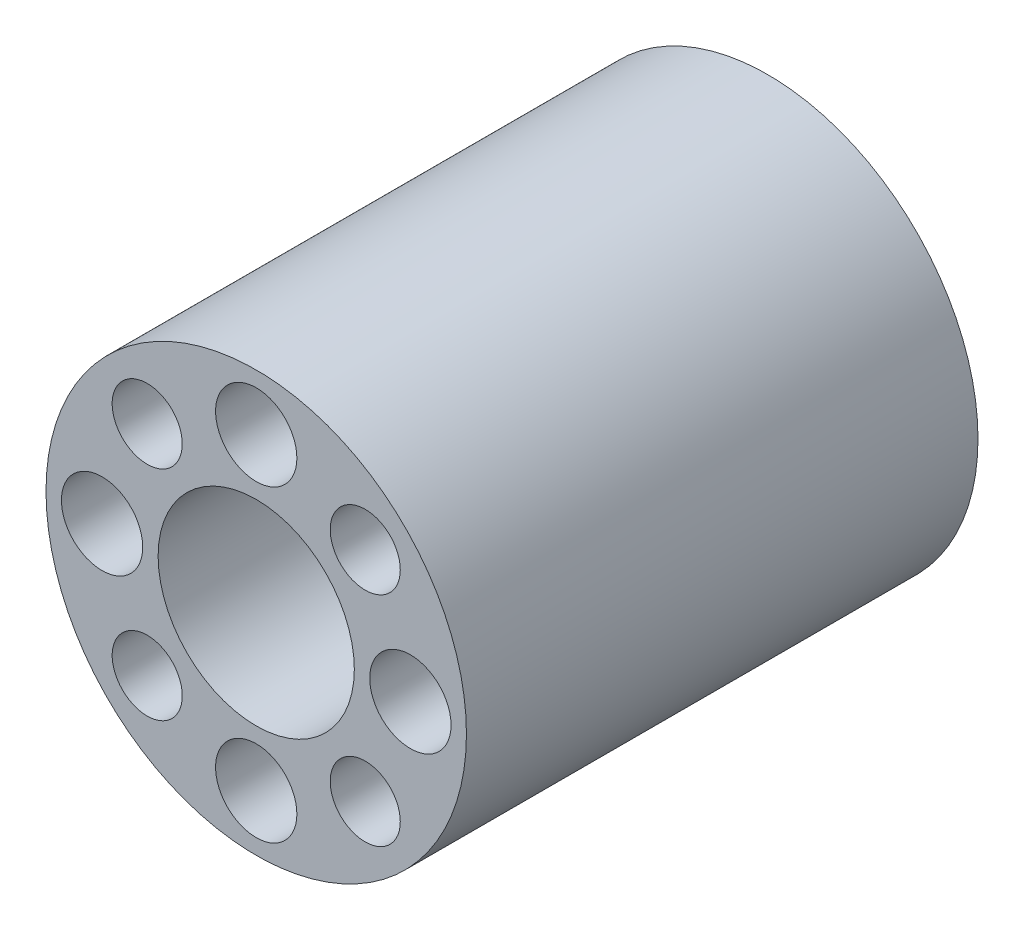
ISO-10303-21;
HEADER;
FILE_DESCRIPTION(('STEP AP214'),'2;1');
FILE_NAME('part.step','',(''),(''),'','','');
FILE_SCHEMA(('AUTOMOTIVE_DESIGN { 1 0 10303 214 1 1 1 1 }'));
ENDSEC;
DATA;
#1=APPLICATION_CONTEXT('core data for automotive mechanical design processes');
#2=APPLICATION_PROTOCOL_DEFINITION('international standard','automotive_design',2000,#1);
#3=PRODUCT_CONTEXT('',#1,'mechanical');
#4=PRODUCT('Part','Part','',(#3));
#5=PRODUCT_RELATED_PRODUCT_CATEGORY('part','',(#4));
#6=PRODUCT_DEFINITION_FORMATION('','',#4);
#7=PRODUCT_DEFINITION_CONTEXT('part definition',#1,'design');
#8=PRODUCT_DEFINITION('design','',#6,#7);
#9=PRODUCT_DEFINITION_SHAPE('','',#8);
#10=(LENGTH_UNIT() NAMED_UNIT(*) SI_UNIT(.MILLI.,.METRE.));
#11=(NAMED_UNIT(*) PLANE_ANGLE_UNIT() SI_UNIT($,.RADIAN.));
#12=(NAMED_UNIT(*) SI_UNIT($,.STERADIAN.) SOLID_ANGLE_UNIT());
#13=UNCERTAINTY_MEASURE_WITH_UNIT(LENGTH_MEASURE(1.E-05),#10,'distance_accuracy_value','');
#14=(GEOMETRIC_REPRESENTATION_CONTEXT(3) GLOBAL_UNCERTAINTY_ASSIGNED_CONTEXT((#13)) GLOBAL_UNIT_ASSIGNED_CONTEXT((#10,
#11,#12)) REPRESENTATION_CONTEXT('',''));
#15=CARTESIAN_POINT('',(0.,0.,0.));
#16=DIRECTION('',(0.,0.,1.));
#17=DIRECTION('',(1.,0.,0.));
#18=AXIS2_PLACEMENT_3D('',#15,#16,#17);
#19=CARTESIAN_POINT('',(-11.,0.,36.5));
#20=DIRECTION('',(0.,0.,-1.));
#21=DIRECTION('',(-1.,0.,0.));
#22=AXIS2_PLACEMENT_3D('',#19,#20,#21);
#23=CYLINDRICAL_SURFACE('',#22,1.65);
#24=CARTESIAN_POINT('',(-11.,0.,0.));
#25=DIRECTION('',(0.,0.,1.));
#26=DIRECTION('',(1.,0.,0.));
#27=AXIS2_PLACEMENT_3D('',#24,#25,#26);
#28=CIRCLE('',#27,1.65);
#29=CARTESIAN_POINT('',(-9.35,0.,0.));
#30=VERTEX_POINT('',#29);
#31=EDGE_CURVE('E86',#30,#30,#28,.T.);
#32=ORIENTED_EDGE('',*,*,#31,.F.);
#33=EDGE_LOOP('',(#32));
#34=FACE_BOUND('',#33,.T.);
#35=CARTESIAN_POINT('',(-11.,0.,12.));
#36=DIRECTION('',(0.,0.,1.));
#37=DIRECTION('',(1.,0.,0.));
#38=AXIS2_PLACEMENT_3D('',#35,#36,#37);
#39=CIRCLE('',#38,1.65);
#40=CARTESIAN_POINT('',(-9.35,0.,12.));
#41=VERTEX_POINT('',#40);
#42=EDGE_CURVE('E43',#41,#41,#39,.T.);
#43=ORIENTED_EDGE('',*,*,#42,.T.);
#44=EDGE_LOOP('',(#43));
#45=FACE_BOUND('',#44,.T.);
#46=ADVANCED_FACE('F39',(#34,#45),#23,.F.);
#47=CARTESIAN_POINT('',(1.95156391047391E-13,11.,36.5));
#48=DIRECTION('',(0.,0.,-1.));
#49=DIRECTION('',(-1.,0.,0.));
#50=AXIS2_PLACEMENT_3D('',#47,#48,#49);
#51=CYLINDRICAL_SURFACE('',#50,1.65);
#52=CARTESIAN_POINT('',(1.95156391047391E-13,11.,0.));
#53=DIRECTION('',(0.,0.,1.));
#54=DIRECTION('',(1.,0.,0.));
#55=AXIS2_PLACEMENT_3D('',#52,#53,#54);
#56=CIRCLE('',#55,1.65);
#57=CARTESIAN_POINT('',(1.6500000000002,11.,0.));
#58=VERTEX_POINT('',#57);
#59=EDGE_CURVE('E78',#58,#58,#56,.T.);
#60=ORIENTED_EDGE('',*,*,#59,.F.);
#61=EDGE_LOOP('',(#60));
#62=FACE_BOUND('',#61,.T.);
#63=CARTESIAN_POINT('',(1.95156391047391E-13,11.,12.));
#64=DIRECTION('',(0.,0.,1.));
#65=DIRECTION('',(1.,0.,0.));
#66=AXIS2_PLACEMENT_3D('',#63,#64,#65);
#67=CIRCLE('',#66,1.65);
#68=CARTESIAN_POINT('',(1.6500000000002,11.,12.));
#69=VERTEX_POINT('',#68);
#70=EDGE_CURVE('E64',#69,#69,#67,.T.);
#71=ORIENTED_EDGE('',*,*,#70,.T.);
#72=EDGE_LOOP('',(#71));
#73=FACE_BOUND('',#72,.T.);
#74=ADVANCED_FACE('F112',(#62,#73),#51,.F.);
#75=CARTESIAN_POINT('',(11.,-2.34187669256869E-13,36.5));
#76=DIRECTION('',(0.,0.,-1.));
#77=DIRECTION('',(-1.,0.,0.));
#78=AXIS2_PLACEMENT_3D('',#75,#76,#77);
#79=CYLINDRICAL_SURFACE('',#78,1.65);
#80=CARTESIAN_POINT('',(11.,-2.34187669256869E-13,0.));
#81=DIRECTION('',(0.,0.,1.));
#82=DIRECTION('',(1.,0.,0.));
#83=AXIS2_PLACEMENT_3D('',#80,#81,#82);
#84=CIRCLE('',#83,1.65);
#85=CARTESIAN_POINT('',(12.65,-2.34187669256869E-13,0.));
#86=VERTEX_POINT('',#85);
#87=EDGE_CURVE('E73',#86,#86,#84,.T.);
#88=ORIENTED_EDGE('',*,*,#87,.F.);
#89=EDGE_LOOP('',(#88));
#90=FACE_BOUND('',#89,.T.);
#91=CARTESIAN_POINT('',(11.,-2.34187669256869E-13,12.));
#92=DIRECTION('',(0.,0.,1.));
#93=DIRECTION('',(1.,0.,0.));
#94=AXIS2_PLACEMENT_3D('',#91,#92,#93);
#95=CIRCLE('',#94,1.65);
#96=CARTESIAN_POINT('',(12.65,-2.34187669256869E-13,12.));
#97=VERTEX_POINT('',#96);
#98=EDGE_CURVE('E61',#97,#97,#95,.T.);
#99=ORIENTED_EDGE('',*,*,#98,.T.);
#100=EDGE_LOOP('',(#99));
#101=FACE_BOUND('',#100,.T.);
#102=ADVANCED_FACE('F117',(#90,#101),#79,.F.);
#103=CARTESIAN_POINT('',(-2.68456451094007E-13,-11.,36.5));
#104=DIRECTION('',(0.,0.,-1.));
#105=DIRECTION('',(-1.,0.,0.));
#106=AXIS2_PLACEMENT_3D('',#103,#104,#105);
#107=CYLINDRICAL_SURFACE('',#106,1.65);
#108=CARTESIAN_POINT('',(-2.68456451094007E-13,-11.,0.));
#109=DIRECTION('',(0.,0.,1.));
#110=DIRECTION('',(1.,0.,0.));
#111=AXIS2_PLACEMENT_3D('',#108,#109,#110);
#112=CIRCLE('',#111,1.65);
#113=CARTESIAN_POINT('',(1.64999999999973,-11.,0.));
#114=VERTEX_POINT('',#113);
#115=EDGE_CURVE('E69',#114,#114,#112,.T.);
#116=ORIENTED_EDGE('',*,*,#115,.F.);
#117=EDGE_LOOP('',(#116));
#118=FACE_BOUND('',#117,.T.);
#119=CARTESIAN_POINT('',(-2.68456451094007E-13,-11.,12.));
#120=DIRECTION('',(0.,0.,1.));
#121=DIRECTION('',(1.,0.,0.));
#122=AXIS2_PLACEMENT_3D('',#119,#120,#121);
#123=CIRCLE('',#122,1.65);
#124=CARTESIAN_POINT('',(1.64999999999973,-11.,12.));
#125=VERTEX_POINT('',#124);
#126=EDGE_CURVE('E58',#125,#125,#123,.T.);
#127=ORIENTED_EDGE('',*,*,#126,.T.);
#128=EDGE_LOOP('',(#127));
#129=FACE_BOUND('',#128,.T.);
#130=ADVANCED_FACE('F124',(#118,#129),#107,.F.);
#131=CARTESIAN_POINT('',(0.,0.,36.5));
#132=DIRECTION('',(0.,0.,1.));
#133=DIRECTION('',(1.,0.,0.));
#134=AXIS2_PLACEMENT_3D('',#131,#132,#133);
#135=PLANE('',#134);
#136=CARTESIAN_POINT('',(-7.77817459305206,-7.77817459305198,36.5));
#137=DIRECTION('',(0.,0.,1.));
#138=DIRECTION('',(1.,0.,0.));
#139=AXIS2_PLACEMENT_3D('',#136,#137,#138);
#140=CIRCLE('',#139,2.5);
#141=CARTESIAN_POINT('',(-5.27817459305206,-7.77817459305198,36.5));
#142=VERTEX_POINT('',#141);
#143=EDGE_CURVE('E211',#142,#142,#140,.T.);
#144=ORIENTED_EDGE('',*,*,#143,.F.);
#145=EDGE_LOOP('',(#144));
#146=FACE_BOUND('',#145,.T.);
#147=CARTESIAN_POINT('',(7.77817459305201,-7.77817459305204,36.5));
#148=DIRECTION('',(0.,0.,1.));
#149=DIRECTION('',(1.,0.,0.));
#150=AXIS2_PLACEMENT_3D('',#147,#148,#149);
#151=CIRCLE('',#150,2.5);
#152=CARTESIAN_POINT('',(10.278174593052,-7.77817459305204,36.5));
#153=VERTEX_POINT('',#152);
#154=EDGE_CURVE('E203',#153,#153,#151,.T.);
#155=ORIENTED_EDGE('',*,*,#154,.F.);
#156=EDGE_LOOP('',(#155));
#157=FACE_BOUND('',#156,.T.);
#158=CARTESIAN_POINT('',(7.77817459305201,7.77817459305204,36.5));
#159=DIRECTION('',(0.,0.,1.));
#160=DIRECTION('',(1.,0.,0.));
#161=AXIS2_PLACEMENT_3D('',#158,#159,#160);
#162=CIRCLE('',#161,2.5);
#163=CARTESIAN_POINT('',(10.278174593052,7.77817459305204,36.5));
#164=VERTEX_POINT('',#163);
#165=EDGE_CURVE('E196',#164,#164,#162,.T.);
#166=ORIENTED_EDGE('',*,*,#165,.F.);
#167=EDGE_LOOP('',(#166));
#168=FACE_BOUND('',#167,.T.);
#169=CARTESIAN_POINT('',(-7.77817459305206,7.77817459305198,36.5));
#170=DIRECTION('',(0.,0.,1.));
#171=DIRECTION('',(1.,0.,0.));
#172=AXIS2_PLACEMENT_3D('',#169,#170,#171);
#173=CIRCLE('',#172,2.5);
#174=CARTESIAN_POINT('',(-5.27817459305206,7.77817459305198,36.5));
#175=VERTEX_POINT('',#174);
#176=EDGE_CURVE('E198',#175,#175,#173,.T.);
#177=ORIENTED_EDGE('',*,*,#176,.F.);
#178=EDGE_LOOP('',(#177));
#179=FACE_BOUND('',#178,.T.);
#180=CARTESIAN_POINT('',(0.,11.,36.5));
#181=DIRECTION('',(0.,0.,1.));
#182=DIRECTION('',(1.,0.,0.));
#183=AXIS2_PLACEMENT_3D('',#180,#181,#182);
#184=CIRCLE('',#183,2.9);
#185=CARTESIAN_POINT('',(2.90000000000004,11.,36.5));
#186=VERTEX_POINT('',#185);
#187=EDGE_CURVE('E220',#186,#186,#184,.T.);
#188=ORIENTED_EDGE('',*,*,#187,.F.);
#189=EDGE_LOOP('',(#188));
#190=FACE_BOUND('',#189,.T.);
#191=CARTESIAN_POINT('',(11.,0.,36.5));
#192=DIRECTION('',(0.,0.,1.));
#193=DIRECTION('',(1.,0.,0.));
#194=AXIS2_PLACEMENT_3D('',#191,#192,#193);
#195=CIRCLE('',#194,2.9);
#196=CARTESIAN_POINT('',(13.9,0.,36.5));
#197=VERTEX_POINT('',#196);
#198=EDGE_CURVE('E223',#197,#197,#195,.T.);
#199=ORIENTED_EDGE('',*,*,#198,.F.);
#200=EDGE_LOOP('',(#199));
#201=FACE_BOUND('',#200,.T.);
#202=CARTESIAN_POINT('',(-11.,0.,36.5));
#203=DIRECTION('',(0.,0.,1.));
#204=DIRECTION('',(1.,0.,0.));
#205=AXIS2_PLACEMENT_3D('',#202,#203,#204);
#206=CIRCLE('',#205,2.9);
#207=CARTESIAN_POINT('',(-8.1,0.,36.5));
#208=VERTEX_POINT('',#207);
#209=EDGE_CURVE('E229',#208,#208,#206,.T.);
#210=ORIENTED_EDGE('',*,*,#209,.F.);
#211=EDGE_LOOP('',(#210));
#212=FACE_BOUND('',#211,.T.);
#213=CARTESIAN_POINT('',(-1.15218884181823E-13,-11.,36.5));
#214=DIRECTION('',(0.,0.,1.));
#215=DIRECTION('',(1.,0.,0.));
#216=AXIS2_PLACEMENT_3D('',#213,#214,#215);
#217=CIRCLE('',#216,2.9);
#218=CARTESIAN_POINT('',(2.89999999999988,-11.,36.5));
#219=VERTEX_POINT('',#218);
#220=EDGE_CURVE('E81',#219,#219,#217,.T.);
#221=ORIENTED_EDGE('',*,*,#220,.F.);
#222=EDGE_LOOP('',(#221));
#223=FACE_BOUND('',#222,.T.);
#224=CARTESIAN_POINT('',(0.,0.,36.5));
#225=DIRECTION('',(0.,0.,1.));
#226=DIRECTION('',(1.,0.,0.));
#227=AXIS2_PLACEMENT_3D('',#224,#225,#226);
#228=CIRCLE('',#227,15.);
#229=CARTESIAN_POINT('',(15.,0.,36.5));
#230=VERTEX_POINT('',#229);
#231=EDGE_CURVE('E11',#230,#230,#228,.T.);
#232=ORIENTED_EDGE('',*,*,#231,.T.);
#233=EDGE_LOOP('',(#232));
#234=FACE_BOUND('',#233,.T.);
#235=CARTESIAN_POINT('',(0.,0.,36.5));
#236=DIRECTION('',(0.,0.,1.));
#237=DIRECTION('',(1.,0.,0.));
#238=AXIS2_PLACEMENT_3D('',#235,#236,#237);
#239=CIRCLE('',#238,7.);
#240=CARTESIAN_POINT('',(7.,0.,36.5));
#241=VERTEX_POINT('',#240);
#242=EDGE_CURVE('E52',#241,#241,#239,.T.);
#243=ORIENTED_EDGE('',*,*,#242,.F.);
#244=EDGE_LOOP('',(#243));
#245=FACE_BOUND('',#244,.T.);
#246=ADVANCED_FACE('F128',(#146,#157,#168,#179,#190,#201,#212,#223,#234,#245),#135,.T.);
#247=CARTESIAN_POINT('',(0.,0.,0.));
#248=DIRECTION('',(0.,0.,1.));
#249=DIRECTION('',(1.,0.,0.));
#250=AXIS2_PLACEMENT_3D('',#247,#248,#249);
#251=PLANE('',#250);
#252=CARTESIAN_POINT('',(0.,0.,0.));
#253=DIRECTION('',(0.,0.,1.));
#254=DIRECTION('',(1.,0.,0.));
#255=AXIS2_PLACEMENT_3D('',#252,#253,#254);
#256=CIRCLE('',#255,15.);
#257=CARTESIAN_POINT('',(15.,0.,0.));
#258=VERTEX_POINT('',#257);
#259=EDGE_CURVE('E47',#258,#258,#256,.T.);
#260=ORIENTED_EDGE('',*,*,#259,.F.);
#261=EDGE_LOOP('',(#260));
#262=FACE_BOUND('',#261,.T.);
#263=CARTESIAN_POINT('',(0.,0.,0.));
#264=DIRECTION('',(0.,0.,1.));
#265=DIRECTION('',(1.,0.,0.));
#266=AXIS2_PLACEMENT_3D('',#263,#264,#265);
#267=CIRCLE('',#266,7.);
#268=CARTESIAN_POINT('',(7.,0.,0.));
#269=VERTEX_POINT('',#268);
#270=EDGE_CURVE('E55',#269,#269,#267,.T.);
#271=ORIENTED_EDGE('',*,*,#270,.T.);
#272=EDGE_LOOP('',(#271));
#273=FACE_BOUND('',#272,.T.);
#274=ORIENTED_EDGE('',*,*,#31,.T.);
#275=EDGE_LOOP('',(#274));
#276=FACE_BOUND('',#275,.T.);
#277=ORIENTED_EDGE('',*,*,#59,.T.);
#278=EDGE_LOOP('',(#277));
#279=FACE_BOUND('',#278,.T.);
#280=ORIENTED_EDGE('',*,*,#87,.T.);
#281=EDGE_LOOP('',(#280));
#282=FACE_BOUND('',#281,.T.);
#283=ORIENTED_EDGE('',*,*,#115,.T.);
#284=EDGE_LOOP('',(#283));
#285=FACE_BOUND('',#284,.T.);
#286=ADVANCED_FACE('F94',(#262,#273,#276,#279,#282,#285),#251,.F.);
#287=CARTESIAN_POINT('',(0.,0.,36.5));
#288=DIRECTION('',(0.,0.,-1.));
#289=DIRECTION('',(-1.,0.,0.));
#290=AXIS2_PLACEMENT_3D('',#287,#288,#289);
#291=CYLINDRICAL_SURFACE('',#290,15.);
#292=ORIENTED_EDGE('',*,*,#231,.F.);
#293=EDGE_LOOP('',(#292));
#294=FACE_BOUND('',#293,.T.);
#295=ORIENTED_EDGE('',*,*,#259,.T.);
#296=EDGE_LOOP('',(#295));
#297=FACE_BOUND('',#296,.T.);
#298=ADVANCED_FACE('F41',(#294,#297),#291,.T.);
#299=CARTESIAN_POINT('',(0.,0.,36.5));
#300=DIRECTION('',(0.,0.,-1.));
#301=DIRECTION('',(-1.,0.,0.));
#302=AXIS2_PLACEMENT_3D('',#299,#300,#301);
#303=CYLINDRICAL_SURFACE('',#302,7.);
#304=ORIENTED_EDGE('',*,*,#242,.T.);
#305=EDGE_LOOP('',(#304));
#306=FACE_BOUND('',#305,.T.);
#307=ORIENTED_EDGE('',*,*,#270,.F.);
#308=EDGE_LOOP('',(#307));
#309=FACE_BOUND('',#308,.T.);
#310=ADVANCED_FACE('F97',(#306,#309),#303,.F.);
#311=CARTESIAN_POINT('',(-1.15218884181823E-13,-11.,-8.20243866176395));
#312=DIRECTION('',(0.,0.,1.));
#313=DIRECTION('',(1.,0.,0.));
#314=AXIS2_PLACEMENT_3D('',#311,#312,#313);
#315=CYLINDRICAL_SURFACE('',#314,2.9);
#316=CARTESIAN_POINT('',(-1.15218884181823E-13,-11.,12.));
#317=DIRECTION('',(0.,0.,1.));
#318=DIRECTION('',(1.,0.,0.));
#319=AXIS2_PLACEMENT_3D('',#316,#317,#318);
#320=CIRCLE('',#319,2.9);
#321=CARTESIAN_POINT('',(2.89999999999988,-11.,12.));
#322=VERTEX_POINT('',#321);
#323=EDGE_CURVE('E218',#322,#322,#320,.F.);
#324=ORIENTED_EDGE('',*,*,#323,.T.);
#325=EDGE_LOOP('',(#324));
#326=FACE_BOUND('',#325,.T.);
#327=ORIENTED_EDGE('',*,*,#220,.T.);
#328=EDGE_LOOP('',(#327));
#329=FACE_BOUND('',#328,.T.);
#330=ADVANCED_FACE('F99',(#326,#329),#315,.F.);
#331=CARTESIAN_POINT('',(0.,0.,12.));
#332=DIRECTION('',(0.,0.,1.));
#333=DIRECTION('',(1.,0.,0.));
#334=AXIS2_PLACEMENT_3D('',#331,#332,#333);
#335=PLANE('',#334);
#336=ORIENTED_EDGE('',*,*,#126,.F.);
#337=EDGE_LOOP('',(#336));
#338=FACE_BOUND('',#337,.T.);
#339=ORIENTED_EDGE('',*,*,#323,.F.);
#340=EDGE_LOOP('',(#339));
#341=FACE_BOUND('',#340,.T.);
#342=ADVANCED_FACE('F106',(#338,#341),#335,.T.);
#343=CARTESIAN_POINT('',(11.,0.,-8.20243866176395));
#344=DIRECTION('',(0.,0.,1.));
#345=DIRECTION('',(1.,0.,0.));
#346=AXIS2_PLACEMENT_3D('',#343,#344,#345);
#347=CYLINDRICAL_SURFACE('',#346,2.9);
#348=CARTESIAN_POINT('',(11.,0.,12.));
#349=DIRECTION('',(0.,0.,1.));
#350=DIRECTION('',(1.,0.,0.));
#351=AXIS2_PLACEMENT_3D('',#348,#349,#350);
#352=CIRCLE('',#351,2.9);
#353=CARTESIAN_POINT('',(13.9,0.,12.));
#354=VERTEX_POINT('',#353);
#355=EDGE_CURVE('E226',#354,#354,#352,.F.);
#356=ORIENTED_EDGE('',*,*,#355,.T.);
#357=EDGE_LOOP('',(#356));
#358=FACE_BOUND('',#357,.T.);
#359=ORIENTED_EDGE('',*,*,#198,.T.);
#360=EDGE_LOOP('',(#359));
#361=FACE_BOUND('',#360,.T.);
#362=ADVANCED_FACE('F131',(#358,#361),#347,.F.);
#363=CARTESIAN_POINT('',(0.,0.,12.));
#364=DIRECTION('',(0.,0.,1.));
#365=DIRECTION('',(1.,0.,0.));
#366=AXIS2_PLACEMENT_3D('',#363,#364,#365);
#367=PLANE('',#366);
#368=ORIENTED_EDGE('',*,*,#98,.F.);
#369=EDGE_LOOP('',(#368));
#370=FACE_BOUND('',#369,.T.);
#371=ORIENTED_EDGE('',*,*,#355,.F.);
#372=EDGE_LOOP('',(#371));
#373=FACE_BOUND('',#372,.T.);
#374=ADVANCED_FACE('F144',(#370,#373),#367,.T.);
#375=CARTESIAN_POINT('',(0.,11.,-8.20243866176395));
#376=DIRECTION('',(0.,0.,1.));
#377=DIRECTION('',(1.,0.,0.));
#378=AXIS2_PLACEMENT_3D('',#375,#376,#377);
#379=CYLINDRICAL_SURFACE('',#378,2.9);
#380=CARTESIAN_POINT('',(0.,11.,12.));
#381=DIRECTION('',(0.,0.,1.));
#382=DIRECTION('',(1.,0.,0.));
#383=AXIS2_PLACEMENT_3D('',#380,#381,#382);
#384=CIRCLE('',#383,2.9);
#385=CARTESIAN_POINT('',(2.90000000000004,11.,12.));
#386=VERTEX_POINT('',#385);
#387=EDGE_CURVE('E62',#386,#386,#384,.F.);
#388=ORIENTED_EDGE('',*,*,#387,.T.);
#389=EDGE_LOOP('',(#388));
#390=FACE_BOUND('',#389,.T.);
#391=ORIENTED_EDGE('',*,*,#187,.T.);
#392=EDGE_LOOP('',(#391));
#393=FACE_BOUND('',#392,.T.);
#394=ADVANCED_FACE('F147',(#390,#393),#379,.F.);
#395=CARTESIAN_POINT('',(0.,0.,12.));
#396=DIRECTION('',(0.,0.,1.));
#397=DIRECTION('',(1.,0.,0.));
#398=AXIS2_PLACEMENT_3D('',#395,#396,#397);
#399=PLANE('',#398);
#400=ORIENTED_EDGE('',*,*,#70,.F.);
#401=EDGE_LOOP('',(#400));
#402=FACE_BOUND('',#401,.T.);
#403=ORIENTED_EDGE('',*,*,#387,.F.);
#404=EDGE_LOOP('',(#403));
#405=FACE_BOUND('',#404,.T.);
#406=ADVANCED_FACE('F142',(#402,#405),#399,.T.);
#407=CARTESIAN_POINT('',(-11.,0.,-8.20243866176395));
#408=DIRECTION('',(0.,0.,1.));
#409=DIRECTION('',(1.,0.,0.));
#410=AXIS2_PLACEMENT_3D('',#407,#408,#409);
#411=CYLINDRICAL_SURFACE('',#410,2.9);
#412=CARTESIAN_POINT('',(-11.,0.,12.));
#413=DIRECTION('',(0.,0.,1.));
#414=DIRECTION('',(1.,0.,0.));
#415=AXIS2_PLACEMENT_3D('',#412,#413,#414);
#416=CIRCLE('',#415,2.9);
#417=CARTESIAN_POINT('',(-8.1,0.,12.));
#418=VERTEX_POINT('',#417);
#419=EDGE_CURVE('E232',#418,#418,#416,.F.);
#420=ORIENTED_EDGE('',*,*,#419,.T.);
#421=EDGE_LOOP('',(#420));
#422=FACE_BOUND('',#421,.T.);
#423=ORIENTED_EDGE('',*,*,#209,.T.);
#424=EDGE_LOOP('',(#423));
#425=FACE_BOUND('',#424,.T.);
#426=ADVANCED_FACE('F138',(#422,#425),#411,.F.);
#427=CARTESIAN_POINT('',(0.,0.,12.));
#428=DIRECTION('',(0.,0.,1.));
#429=DIRECTION('',(1.,0.,0.));
#430=AXIS2_PLACEMENT_3D('',#427,#428,#429);
#431=PLANE('',#430);
#432=ORIENTED_EDGE('',*,*,#42,.F.);
#433=EDGE_LOOP('',(#432));
#434=FACE_BOUND('',#433,.T.);
#435=ORIENTED_EDGE('',*,*,#419,.F.);
#436=EDGE_LOOP('',(#435));
#437=FACE_BOUND('',#436,.T.);
#438=ADVANCED_FACE('F134',(#434,#437),#431,.T.);
#439=CARTESIAN_POINT('',(-7.77817459305206,7.77817459305198,31.5));
#440=DIRECTION('',(0.,0.,1.));
#441=DIRECTION('',(1.,0.,0.));
#442=AXIS2_PLACEMENT_3D('',#439,#440,#441);
#443=CYLINDRICAL_SURFACE('',#442,2.5);
#444=CARTESIAN_POINT('',(-7.77817459305206,7.77817459305198,31.5));
#445=DIRECTION('',(0.,0.,1.));
#446=DIRECTION('',(1.,0.,0.));
#447=AXIS2_PLACEMENT_3D('',#444,#445,#446);
#448=CIRCLE('',#447,2.5);
#449=CARTESIAN_POINT('',(-5.27817459305206,7.77817459305198,31.5));
#450=VERTEX_POINT('',#449);
#451=EDGE_CURVE('E201',#450,#450,#448,.T.);
#452=ORIENTED_EDGE('',*,*,#451,.F.);
#453=EDGE_LOOP('',(#452));
#454=FACE_BOUND('',#453,.T.);
#455=ORIENTED_EDGE('',*,*,#176,.T.);
#456=EDGE_LOOP('',(#455));
#457=FACE_BOUND('',#456,.T.);
#458=ADVANCED_FACE('F137',(#454,#457),#443,.F.);
#459=CARTESIAN_POINT('',(-7.77817459305206,7.77817459305198,31.5));
#460=DIRECTION('',(0.,0.,1.));
#461=DIRECTION('',(1.,0.,0.));
#462=AXIS2_PLACEMENT_3D('',#459,#460,#461);
#463=PLANE('',#462);
#464=ORIENTED_EDGE('',*,*,#451,.T.);
#465=EDGE_LOOP('',(#464));
#466=FACE_BOUND('',#465,.T.);
#467=ADVANCED_FACE('F160',(#466),#463,.T.);
#468=CARTESIAN_POINT('',(7.77817459305201,7.77817459305204,31.5));
#469=DIRECTION('',(0.,0.,1.));
#470=DIRECTION('',(1.,0.,0.));
#471=AXIS2_PLACEMENT_3D('',#468,#469,#470);
#472=CYLINDRICAL_SURFACE('',#471,2.5);
#473=CARTESIAN_POINT('',(7.77817459305201,7.77817459305204,31.5));
#474=DIRECTION('',(0.,0.,1.));
#475=DIRECTION('',(1.,0.,0.));
#476=AXIS2_PLACEMENT_3D('',#473,#474,#475);
#477=CIRCLE('',#476,2.5);
#478=CARTESIAN_POINT('',(10.278174593052,7.77817459305204,31.5));
#479=VERTEX_POINT('',#478);
#480=EDGE_CURVE('E193',#479,#479,#477,.T.);
#481=ORIENTED_EDGE('',*,*,#480,.F.);
#482=EDGE_LOOP('',(#481));
#483=FACE_BOUND('',#482,.T.);
#484=ORIENTED_EDGE('',*,*,#165,.T.);
#485=EDGE_LOOP('',(#484));
#486=FACE_BOUND('',#485,.T.);
#487=ADVANCED_FACE('F164',(#483,#486),#472,.F.);
#488=CARTESIAN_POINT('',(7.77817459305201,7.77817459305204,31.5));
#489=DIRECTION('',(0.,0.,1.));
#490=DIRECTION('',(1.,0.,0.));
#491=AXIS2_PLACEMENT_3D('',#488,#489,#490);
#492=PLANE('',#491);
#493=ORIENTED_EDGE('',*,*,#480,.T.);
#494=EDGE_LOOP('',(#493));
#495=FACE_BOUND('',#494,.T.);
#496=ADVANCED_FACE('F181',(#495),#492,.T.);
#497=CARTESIAN_POINT('',(7.77817459305201,-7.77817459305204,31.5));
#498=DIRECTION('',(0.,0.,1.));
#499=DIRECTION('',(1.,0.,0.));
#500=AXIS2_PLACEMENT_3D('',#497,#498,#499);
#501=CYLINDRICAL_SURFACE('',#500,2.5);
#502=CARTESIAN_POINT('',(7.77817459305201,-7.77817459305204,31.5));
#503=DIRECTION('',(0.,0.,1.));
#504=DIRECTION('',(1.,0.,0.));
#505=AXIS2_PLACEMENT_3D('',#502,#503,#504);
#506=CIRCLE('',#505,2.5);
#507=CARTESIAN_POINT('',(10.278174593052,-7.77817459305204,31.5));
#508=VERTEX_POINT('',#507);
#509=EDGE_CURVE('E208',#508,#508,#506,.T.);
#510=ORIENTED_EDGE('',*,*,#509,.F.);
#511=EDGE_LOOP('',(#510));
#512=FACE_BOUND('',#511,.T.);
#513=ORIENTED_EDGE('',*,*,#154,.T.);
#514=EDGE_LOOP('',(#513));
#515=FACE_BOUND('',#514,.T.);
#516=ADVANCED_FACE('F177',(#512,#515),#501,.F.);
#517=CARTESIAN_POINT('',(7.77817459305201,-7.77817459305204,31.5));
#518=DIRECTION('',(0.,0.,1.));
#519=DIRECTION('',(1.,0.,0.));
#520=AXIS2_PLACEMENT_3D('',#517,#518,#519);
#521=PLANE('',#520);
#522=ORIENTED_EDGE('',*,*,#509,.T.);
#523=EDGE_LOOP('',(#522));
#524=FACE_BOUND('',#523,.T.);
#525=ADVANCED_FACE('F173',(#524),#521,.T.);
#526=CARTESIAN_POINT('',(-7.77817459305206,-7.77817459305198,31.5));
#527=DIRECTION('',(0.,0.,1.));
#528=DIRECTION('',(1.,0.,0.));
#529=AXIS2_PLACEMENT_3D('',#526,#527,#528);
#530=CYLINDRICAL_SURFACE('',#529,2.5);
#531=CARTESIAN_POINT('',(-7.77817459305206,-7.77817459305198,31.5));
#532=DIRECTION('',(0.,0.,1.));
#533=DIRECTION('',(1.,0.,0.));
#534=AXIS2_PLACEMENT_3D('',#531,#532,#533);
#535=CIRCLE('',#534,2.5);
#536=CARTESIAN_POINT('',(-5.27817459305206,-7.77817459305198,31.5));
#537=VERTEX_POINT('',#536);
#538=EDGE_CURVE('E214',#537,#537,#535,.T.);
#539=ORIENTED_EDGE('',*,*,#538,.F.);
#540=EDGE_LOOP('',(#539));
#541=FACE_BOUND('',#540,.T.);
#542=ORIENTED_EDGE('',*,*,#143,.T.);
#543=EDGE_LOOP('',(#542));
#544=FACE_BOUND('',#543,.T.);
#545=ADVANCED_FACE('F169',(#541,#544),#530,.F.);
#546=CARTESIAN_POINT('',(-7.77817459305206,-7.77817459305198,31.5));
#547=DIRECTION('',(0.,0.,1.));
#548=DIRECTION('',(1.,0.,0.));
#549=AXIS2_PLACEMENT_3D('',#546,#547,#548);
#550=PLANE('',#549);
#551=ORIENTED_EDGE('',*,*,#538,.T.);
#552=EDGE_LOOP('',(#551));
#553=FACE_BOUND('',#552,.T.);
#554=ADVANCED_FACE('F166',(#553),#550,.T.);
#555=CLOSED_SHELL('',(#46,#74,#102,#130,#246,#286,#298,#310,#330,#342,#362,#374,#394,#406,#426,
#438,#458,#467,#487,#496,#516,#525,#545,#554));
#556=MANIFOLD_SOLID_BREP('B2',#555);
#557=ADVANCED_BREP_SHAPE_REPRESENTATION('',(#18,#556),#14);
#558=SHAPE_DEFINITION_REPRESENTATION(#9,#557);
ENDSEC;
END-ISO-10303-21;
